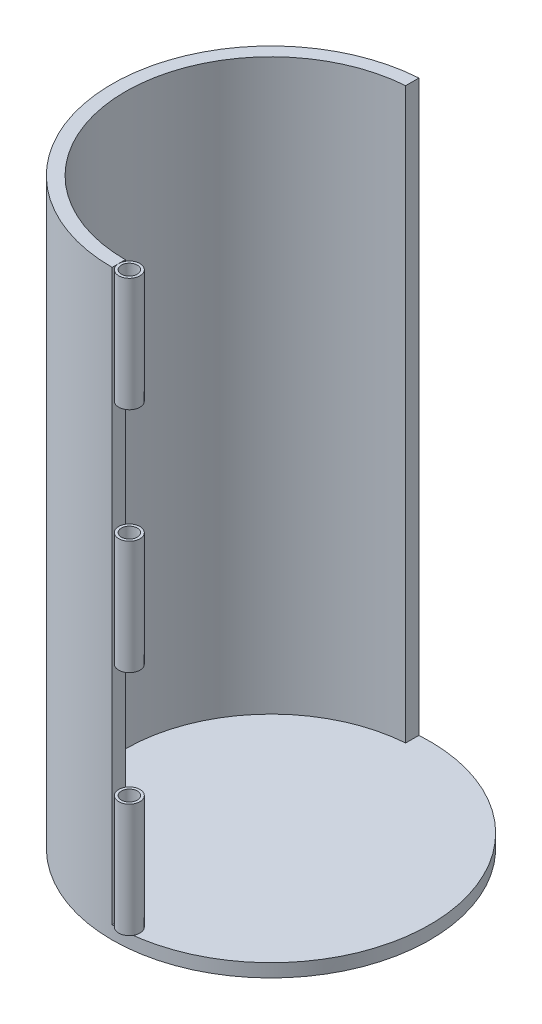
ISO-10303-21;
HEADER;
FILE_DESCRIPTION(('STEP AP214'),'2;1');
FILE_NAME('part.step','',(''),(''),'','','');
FILE_SCHEMA(('AUTOMOTIVE_DESIGN { 1 0 10303 214 1 1 1 1 }'));
ENDSEC;
DATA;
#1=APPLICATION_CONTEXT('core data for automotive mechanical design processes');
#2=APPLICATION_PROTOCOL_DEFINITION('international standard','automotive_design',2000,#1);
#3=PRODUCT_CONTEXT('',#1,'mechanical');
#4=PRODUCT('Part','Part','',(#3));
#5=PRODUCT_RELATED_PRODUCT_CATEGORY('part','',(#4));
#6=PRODUCT_DEFINITION_FORMATION('','',#4);
#7=PRODUCT_DEFINITION_CONTEXT('part definition',#1,'design');
#8=PRODUCT_DEFINITION('design','',#6,#7);
#9=PRODUCT_DEFINITION_SHAPE('','',#8);
#10=(LENGTH_UNIT() NAMED_UNIT(*) SI_UNIT(.MILLI.,.METRE.));
#11=(NAMED_UNIT(*) PLANE_ANGLE_UNIT() SI_UNIT($,.RADIAN.));
#12=(NAMED_UNIT(*) SI_UNIT($,.STERADIAN.) SOLID_ANGLE_UNIT());
#13=UNCERTAINTY_MEASURE_WITH_UNIT(LENGTH_MEASURE(1.E-05),#10,'distance_accuracy_value','');
#14=(GEOMETRIC_REPRESENTATION_CONTEXT(3) GLOBAL_UNCERTAINTY_ASSIGNED_CONTEXT((#13)) GLOBAL_UNIT_ASSIGNED_CONTEXT((#10,
#11,#12)) REPRESENTATION_CONTEXT('',''));
#15=CARTESIAN_POINT('',(0.,0.,0.));
#16=DIRECTION('',(0.,0.,1.));
#17=DIRECTION('',(1.,0.,0.));
#18=AXIS2_PLACEMENT_3D('',#15,#16,#17);
#19=CARTESIAN_POINT('',(2.,110.,28.75));
#20=DIRECTION('',(0.,1.,0.));
#21=DIRECTION('',(0.,0.,1.));
#22=AXIS2_PLACEMENT_3D('',#19,#20,#21);
#23=PLANE('',#22);
#24=CARTESIAN_POINT('',(2.,110.,28.75));
#25=DIRECTION('',(0.,1.,0.));
#26=DIRECTION('',(0.,0.,1.));
#27=AXIS2_PLACEMENT_3D('',#24,#25,#26);
#28=CIRCLE('',#27,2.);
#29=CARTESIAN_POINT('',(2.,110.,30.75));
#30=VERTEX_POINT('',#29);
#31=EDGE_CURVE('E11',#30,#30,#28,.T.);
#32=ORIENTED_EDGE('',*,*,#31,.T.);
#33=EDGE_LOOP('',(#32));
#34=FACE_BOUND('',#33,.T.);
#35=CARTESIAN_POINT('',(2.,110.,28.75));
#36=DIRECTION('',(0.,1.,0.));
#37=DIRECTION('',(0.,0.,1.));
#38=AXIS2_PLACEMENT_3D('',#35,#36,#37);
#39=CIRCLE('',#38,1.5);
#40=CARTESIAN_POINT('',(2.,110.,30.25));
#41=VERTEX_POINT('',#40);
#42=EDGE_CURVE('E57',#41,#41,#39,.T.);
#43=ORIENTED_EDGE('',*,*,#42,.F.);
#44=EDGE_LOOP('',(#43));
#45=FACE_BOUND('',#44,.T.);
#46=ADVANCED_FACE('F46',(#34,#45),#23,.T.);
#47=CARTESIAN_POINT('',(2.,88.5,28.75));
#48=DIRECTION('',(0.,1.,0.));
#49=DIRECTION('',(0.,0.,1.));
#50=AXIS2_PLACEMENT_3D('',#47,#48,#49);
#51=PLANE('',#50);
#52=CARTESIAN_POINT('',(2.,88.5,28.75));
#53=DIRECTION('',(0.,1.,0.));
#54=DIRECTION('',(0.,0.,1.));
#55=AXIS2_PLACEMENT_3D('',#52,#53,#54);
#56=CIRCLE('',#55,2.);
#57=CARTESIAN_POINT('',(2.,88.5,30.75));
#58=VERTEX_POINT('',#57);
#59=EDGE_CURVE('E50',#58,#58,#56,.T.);
#60=ORIENTED_EDGE('',*,*,#59,.F.);
#61=EDGE_LOOP('',(#60));
#62=FACE_BOUND('',#61,.T.);
#63=CARTESIAN_POINT('',(2.,88.5,28.75));
#64=DIRECTION('',(0.,1.,0.));
#65=DIRECTION('',(0.,0.,1.));
#66=AXIS2_PLACEMENT_3D('',#63,#64,#65);
#67=CIRCLE('',#66,1.5);
#68=CARTESIAN_POINT('',(2.,88.5,30.25));
#69=VERTEX_POINT('',#68);
#70=EDGE_CURVE('E59',#69,#69,#67,.T.);
#71=ORIENTED_EDGE('',*,*,#70,.T.);
#72=EDGE_LOOP('',(#71));
#73=FACE_BOUND('',#72,.T.);
#74=ADVANCED_FACE('F69',(#62,#73),#51,.F.);
#75=CARTESIAN_POINT('',(2.,110.,28.75));
#76=DIRECTION('',(0.,-1.,0.));
#77=DIRECTION('',(0.,0.,-1.));
#78=AXIS2_PLACEMENT_3D('',#75,#76,#77);
#79=CYLINDRICAL_SURFACE('',#78,2.);
#80=ORIENTED_EDGE('',*,*,#31,.F.);
#81=EDGE_LOOP('',(#80));
#82=FACE_BOUND('',#81,.T.);
#83=ORIENTED_EDGE('',*,*,#59,.T.);
#84=EDGE_LOOP('',(#83));
#85=FACE_BOUND('',#84,.T.);
#86=ADVANCED_FACE('F48',(#82,#85),#79,.T.);
#87=CARTESIAN_POINT('',(2.,110.,28.75));
#88=DIRECTION('',(0.,-1.,0.));
#89=DIRECTION('',(0.,0.,-1.));
#90=AXIS2_PLACEMENT_3D('',#87,#88,#89);
#91=CYLINDRICAL_SURFACE('',#90,1.5);
#92=ORIENTED_EDGE('',*,*,#42,.T.);
#93=EDGE_LOOP('',(#92));
#94=FACE_BOUND('',#93,.T.);
#95=ORIENTED_EDGE('',*,*,#70,.F.);
#96=EDGE_LOOP('',(#95));
#97=FACE_BOUND('',#96,.T.);
#98=ADVANCED_FACE('F65',(#94,#97),#91,.F.);
#99=CLOSED_SHELL('',(#46,#74,#86,#98));
#100=MANIFOLD_SOLID_BREP('B2',#99);
#101=CARTESIAN_POINT('',(2.,67.,28.75));
#102=DIRECTION('',(0.,1.,0.));
#103=DIRECTION('',(0.,0.,1.));
#104=AXIS2_PLACEMENT_3D('',#101,#102,#103);
#105=PLANE('',#104);
#106=CARTESIAN_POINT('',(2.,67.,28.75));
#107=DIRECTION('',(0.,1.,0.));
#108=DIRECTION('',(0.,0.,1.));
#109=AXIS2_PLACEMENT_3D('',#106,#107,#108);
#110=CIRCLE('',#109,2.);
#111=CARTESIAN_POINT('',(2.,67.,30.75));
#112=VERTEX_POINT('',#111);
#113=EDGE_CURVE('E45',#112,#112,#110,.T.);
#114=ORIENTED_EDGE('',*,*,#113,.T.);
#115=EDGE_LOOP('',(#114));
#116=FACE_BOUND('',#115,.T.);
#117=CARTESIAN_POINT('',(2.,67.,28.75));
#118=DIRECTION('',(0.,1.,0.));
#119=DIRECTION('',(0.,0.,1.));
#120=AXIS2_PLACEMENT_3D('',#117,#118,#119);
#121=CIRCLE('',#120,1.5);
#122=CARTESIAN_POINT('',(2.,67.,30.25));
#123=VERTEX_POINT('',#122);
#124=EDGE_CURVE('E135',#123,#123,#121,.T.);
#125=ORIENTED_EDGE('',*,*,#124,.F.);
#126=EDGE_LOOP('',(#125));
#127=FACE_BOUND('',#126,.T.);
#128=ADVANCED_FACE('F124',(#116,#127),#105,.T.);
#129=CARTESIAN_POINT('',(2.,45.5,28.75));
#130=DIRECTION('',(0.,1.,0.));
#131=DIRECTION('',(0.,0.,1.));
#132=AXIS2_PLACEMENT_3D('',#129,#130,#131);
#133=PLANE('',#132);
#134=CARTESIAN_POINT('',(2.,45.5,28.75));
#135=DIRECTION('',(0.,1.,0.));
#136=DIRECTION('',(0.,0.,1.));
#137=AXIS2_PLACEMENT_3D('',#134,#135,#136);
#138=CIRCLE('',#137,2.);
#139=CARTESIAN_POINT('',(2.,45.5,30.75));
#140=VERTEX_POINT('',#139);
#141=EDGE_CURVE('E128',#140,#140,#138,.T.);
#142=ORIENTED_EDGE('',*,*,#141,.F.);
#143=EDGE_LOOP('',(#142));
#144=FACE_BOUND('',#143,.T.);
#145=CARTESIAN_POINT('',(2.,45.5,28.75));
#146=DIRECTION('',(0.,1.,0.));
#147=DIRECTION('',(0.,0.,1.));
#148=AXIS2_PLACEMENT_3D('',#145,#146,#147);
#149=CIRCLE('',#148,1.5);
#150=CARTESIAN_POINT('',(2.,45.5,30.25));
#151=VERTEX_POINT('',#150);
#152=EDGE_CURVE('E137',#151,#151,#149,.T.);
#153=ORIENTED_EDGE('',*,*,#152,.T.);
#154=EDGE_LOOP('',(#153));
#155=FACE_BOUND('',#154,.T.);
#156=ADVANCED_FACE('F147',(#144,#155),#133,.F.);
#157=CARTESIAN_POINT('',(2.,67.,28.75));
#158=DIRECTION('',(0.,-1.,0.));
#159=DIRECTION('',(0.,0.,-1.));
#160=AXIS2_PLACEMENT_3D('',#157,#158,#159);
#161=CYLINDRICAL_SURFACE('',#160,2.);
#162=ORIENTED_EDGE('',*,*,#113,.F.);
#163=EDGE_LOOP('',(#162));
#164=FACE_BOUND('',#163,.T.);
#165=ORIENTED_EDGE('',*,*,#141,.T.);
#166=EDGE_LOOP('',(#165));
#167=FACE_BOUND('',#166,.T.);
#168=ADVANCED_FACE('F126',(#164,#167),#161,.T.);
#169=CARTESIAN_POINT('',(2.,67.,28.75));
#170=DIRECTION('',(0.,-1.,0.));
#171=DIRECTION('',(0.,0.,-1.));
#172=AXIS2_PLACEMENT_3D('',#169,#170,#171);
#173=CYLINDRICAL_SURFACE('',#172,1.5);
#174=ORIENTED_EDGE('',*,*,#124,.T.);
#175=EDGE_LOOP('',(#174));
#176=FACE_BOUND('',#175,.T.);
#177=ORIENTED_EDGE('',*,*,#152,.F.);
#178=EDGE_LOOP('',(#177));
#179=FACE_BOUND('',#178,.T.);
#180=ADVANCED_FACE('F143',(#176,#179),#173,.F.);
#181=CLOSED_SHELL('',(#128,#156,#168,#180));
#182=MANIFOLD_SOLID_BREP('B6',#181);
#183=CARTESIAN_POINT('',(2.,24.,28.75));
#184=DIRECTION('',(0.,1.,0.));
#185=DIRECTION('',(0.,0.,1.));
#186=AXIS2_PLACEMENT_3D('',#183,#184,#185);
#187=PLANE('',#186);
#188=CARTESIAN_POINT('',(2.,24.,28.75));
#189=DIRECTION('',(0.,1.,0.));
#190=DIRECTION('',(0.,0.,1.));
#191=AXIS2_PLACEMENT_3D('',#188,#189,#190);
#192=CIRCLE('',#191,2.);
#193=CARTESIAN_POINT('',(2.,24.,30.75));
#194=VERTEX_POINT('',#193);
#195=EDGE_CURVE('E123',#194,#194,#192,.T.);
#196=ORIENTED_EDGE('',*,*,#195,.T.);
#197=EDGE_LOOP('',(#196));
#198=FACE_BOUND('',#197,.T.);
#199=CARTESIAN_POINT('',(2.,24.,28.75));
#200=DIRECTION('',(0.,1.,0.));
#201=DIRECTION('',(0.,0.,1.));
#202=AXIS2_PLACEMENT_3D('',#199,#200,#201);
#203=CIRCLE('',#202,1.5);
#204=CARTESIAN_POINT('',(2.,24.,30.25));
#205=VERTEX_POINT('',#204);
#206=EDGE_CURVE('E214',#205,#205,#203,.T.);
#207=ORIENTED_EDGE('',*,*,#206,.F.);
#208=EDGE_LOOP('',(#207));
#209=FACE_BOUND('',#208,.T.);
#210=ADVANCED_FACE('F203',(#198,#209),#187,.T.);
#211=CARTESIAN_POINT('',(2.,2.5,28.75));
#212=DIRECTION('',(0.,1.,0.));
#213=DIRECTION('',(0.,0.,1.));
#214=AXIS2_PLACEMENT_3D('',#211,#212,#213);
#215=PLANE('',#214);
#216=CARTESIAN_POINT('',(2.,2.5,28.75));
#217=DIRECTION('',(0.,1.,0.));
#218=DIRECTION('',(0.,0.,1.));
#219=AXIS2_PLACEMENT_3D('',#216,#217,#218);
#220=CIRCLE('',#219,2.);
#221=CARTESIAN_POINT('',(2.,2.5,30.75));
#222=VERTEX_POINT('',#221);
#223=EDGE_CURVE('E207',#222,#222,#220,.T.);
#224=ORIENTED_EDGE('',*,*,#223,.F.);
#225=EDGE_LOOP('',(#224));
#226=FACE_BOUND('',#225,.T.);
#227=CARTESIAN_POINT('',(2.,2.5,28.75));
#228=DIRECTION('',(0.,1.,0.));
#229=DIRECTION('',(0.,0.,1.));
#230=AXIS2_PLACEMENT_3D('',#227,#228,#229);
#231=CIRCLE('',#230,1.5);
#232=CARTESIAN_POINT('',(2.,2.5,30.25));
#233=VERTEX_POINT('',#232);
#234=EDGE_CURVE('E216',#233,#233,#231,.T.);
#235=ORIENTED_EDGE('',*,*,#234,.T.);
#236=EDGE_LOOP('',(#235));
#237=FACE_BOUND('',#236,.T.);
#238=ADVANCED_FACE('F226',(#226,#237),#215,.F.);
#239=CARTESIAN_POINT('',(2.,24.,28.75));
#240=DIRECTION('',(0.,-1.,0.));
#241=DIRECTION('',(0.,0.,-1.));
#242=AXIS2_PLACEMENT_3D('',#239,#240,#241);
#243=CYLINDRICAL_SURFACE('',#242,2.);
#244=ORIENTED_EDGE('',*,*,#195,.F.);
#245=EDGE_LOOP('',(#244));
#246=FACE_BOUND('',#245,.T.);
#247=ORIENTED_EDGE('',*,*,#223,.T.);
#248=EDGE_LOOP('',(#247));
#249=FACE_BOUND('',#248,.T.);
#250=ADVANCED_FACE('F205',(#246,#249),#243,.T.);
#251=CARTESIAN_POINT('',(2.,24.,28.75));
#252=DIRECTION('',(0.,-1.,0.));
#253=DIRECTION('',(0.,0.,-1.));
#254=AXIS2_PLACEMENT_3D('',#251,#252,#253);
#255=CYLINDRICAL_SURFACE('',#254,1.5);
#256=ORIENTED_EDGE('',*,*,#206,.T.);
#257=EDGE_LOOP('',(#256));
#258=FACE_BOUND('',#257,.T.);
#259=ORIENTED_EDGE('',*,*,#234,.F.);
#260=EDGE_LOOP('',(#259));
#261=FACE_BOUND('',#260,.T.);
#262=ADVANCED_FACE('F222',(#258,#261),#255,.F.);
#263=CLOSED_SHELL('',(#210,#238,#250,#262));
#264=MANIFOLD_SOLID_BREP('B40',#263);
#265=CARTESIAN_POINT('',(0.,110.,0.));
#266=DIRECTION('',(0.,1.,0.));
#267=DIRECTION('',(0.,0.,1.));
#268=AXIS2_PLACEMENT_3D('',#265,#266,#267);
#269=PLANE('',#268);
#270=CARTESIAN_POINT('',(0.,110.,0.));
#271=DIRECTION('',(0.,1.,0.));
#272=DIRECTION('',(0.,0.,1.));
#273=AXIS2_PLACEMENT_3D('',#270,#271,#272);
#274=CIRCLE('',#273,27.5);
#275=CARTESIAN_POINT('',(-2.,110.,-27.427176303805));
#276=VERTEX_POINT('',#275);
#277=CARTESIAN_POINT('',(0.,110.,27.5));
#278=VERTEX_POINT('',#277);
#279=EDGE_CURVE('E342',#276,#278,#274,.T.);
#280=ORIENTED_EDGE('',*,*,#279,.F.);
#281=DIRECTION('',(0.,0.,-1.));
#282=VECTOR('',#281,1.);
#283=CARTESIAN_POINT('',(-2.,110.,-27.427176303805));
#284=LINE('',#283,#282);
#285=CARTESIAN_POINT('',(-2.,110.,-29.9332590941915));
#286=VERTEX_POINT('',#285);
#287=EDGE_CURVE('E296',#276,#286,#284,.T.);
#288=ORIENTED_EDGE('',*,*,#287,.T.);
#289=CARTESIAN_POINT('',(0.,110.,0.));
#290=DIRECTION('',(0.,1.,0.));
#291=DIRECTION('',(0.,0.,1.));
#292=AXIS2_PLACEMENT_3D('',#289,#290,#291);
#293=CIRCLE('',#292,30.);
#294=CARTESIAN_POINT('',(0.,110.,30.));
#295=VERTEX_POINT('',#294);
#296=EDGE_CURVE('E344',#286,#295,#293,.T.);
#297=ORIENTED_EDGE('',*,*,#296,.T.);
#298=DIRECTION('',(0.,0.,1.));
#299=VECTOR('',#298,1.);
#300=CARTESIAN_POINT('',(0.,110.,30.));
#301=LINE('',#300,#299);
#302=EDGE_CURVE('E329',#278,#295,#301,.T.);
#303=ORIENTED_EDGE('',*,*,#302,.F.);
#304=EDGE_LOOP('',(#280,#288,#297,#303));
#305=FACE_BOUND('',#304,.T.);
#306=ADVANCED_FACE('F273',(#305),#269,.T.);
#307=CARTESIAN_POINT('',(0.,2.5,0.));
#308=DIRECTION('',(0.,-1.,0.));
#309=DIRECTION('',(0.,0.,-1.));
#310=AXIS2_PLACEMENT_3D('',#307,#308,#309);
#311=CYLINDRICAL_SURFACE('',#310,30.);
#312=ORIENTED_EDGE('',*,*,#296,.F.);
#313=DIRECTION('',(0.,-1.,0.));
#314=VECTOR('',#313,1.);
#315=CARTESIAN_POINT('',(-2.,391.5625,-29.9332590941915));
#316=LINE('',#315,#314);
#317=CARTESIAN_POINT('',(-2.,2.5,-29.9332590941915));
#318=VERTEX_POINT('',#317);
#319=EDGE_CURVE('E325',#286,#318,#316,.T.);
#320=ORIENTED_EDGE('',*,*,#319,.T.);
#321=CARTESIAN_POINT('',(0.,2.5,0.));
#322=DIRECTION('',(0.,1.,0.));
#323=DIRECTION('',(0.,0.,-1.));
#324=AXIS2_PLACEMENT_3D('',#321,#322,#323);
#325=CIRCLE('',#324,30.);
#326=CARTESIAN_POINT('',(0.,2.5,30.));
#327=VERTEX_POINT('',#326);
#328=EDGE_CURVE('E288',#327,#318,#325,.T.);
#329=ORIENTED_EDGE('',*,*,#328,.F.);
#330=DIRECTION('',(0.,1.,0.));
#331=VECTOR('',#330,1.);
#332=CARTESIAN_POINT('',(0.,2.5,30.));
#333=LINE('',#332,#331);
#334=EDGE_CURVE('E336',#327,#295,#333,.T.);
#335=ORIENTED_EDGE('',*,*,#334,.T.);
#336=EDGE_LOOP('',(#312,#320,#329,#335));
#337=FACE_BOUND('',#336,.T.);
#338=CARTESIAN_POINT('',(0.,0.,0.));
#339=DIRECTION('',(0.,1.,0.));
#340=DIRECTION('',(0.,0.,1.));
#341=AXIS2_PLACEMENT_3D('',#338,#339,#340);
#342=CIRCLE('',#341,30.);
#343=CARTESIAN_POINT('',(0.,0.,30.));
#344=VERTEX_POINT('',#343);
#345=EDGE_CURVE('E281',#344,#344,#342,.T.);
#346=ORIENTED_EDGE('',*,*,#345,.T.);
#347=EDGE_LOOP('',(#346));
#348=FACE_BOUND('',#347,.T.);
#349=ADVANCED_FACE('F275',(#337,#348),#311,.T.);
#350=CARTESIAN_POINT('',(0.,0.,0.));
#351=DIRECTION('',(0.,1.,0.));
#352=DIRECTION('',(0.,0.,1.));
#353=AXIS2_PLACEMENT_3D('',#350,#351,#352);
#354=PLANE('',#353);
#355=ORIENTED_EDGE('',*,*,#345,.F.);
#356=EDGE_LOOP('',(#355));
#357=FACE_BOUND('',#356,.T.);
#358=ADVANCED_FACE('F349',(#357),#354,.F.);
#359=CARTESIAN_POINT('',(0.,110.,0.));
#360=DIRECTION('',(0.,-1.,0.));
#361=DIRECTION('',(0.,0.,-1.));
#362=AXIS2_PLACEMENT_3D('',#359,#360,#361);
#363=CYLINDRICAL_SURFACE('',#362,27.5);
#364=DIRECTION('',(0.,-1.,0.));
#365=VECTOR('',#364,1.);
#366=CARTESIAN_POINT('',(-2.,391.5625,-27.427176303805));
#367=LINE('',#366,#365);
#368=CARTESIAN_POINT('',(-2.,2.5,-27.427176303805));
#369=VERTEX_POINT('',#368);
#370=EDGE_CURVE('E317',#276,#369,#367,.T.);
#371=ORIENTED_EDGE('',*,*,#370,.F.);
#372=ORIENTED_EDGE('',*,*,#279,.T.);
#373=DIRECTION('',(0.,-1.,0.));
#374=VECTOR('',#373,1.);
#375=CARTESIAN_POINT('',(0.,110.,27.5));
#376=LINE('',#375,#374);
#377=CARTESIAN_POINT('',(0.,2.5,27.5));
#378=VERTEX_POINT('',#377);
#379=EDGE_CURVE('E319',#378,#278,#376,.F.);
#380=ORIENTED_EDGE('',*,*,#379,.F.);
#381=CARTESIAN_POINT('',(0.,2.5,0.));
#382=DIRECTION('',(0.,1.,0.));
#383=DIRECTION('',(0.,0.,1.));
#384=AXIS2_PLACEMENT_3D('',#381,#382,#383);
#385=CIRCLE('',#384,27.5);
#386=EDGE_CURVE('E201',#378,#369,#385,.F.);
#387=ORIENTED_EDGE('',*,*,#386,.T.);
#388=EDGE_LOOP('',(#371,#372,#380,#387));
#389=FACE_BOUND('',#388,.T.);
#390=ADVANCED_FACE('F315',(#389),#363,.F.);
#391=CARTESIAN_POINT('',(0.,2.5,0.));
#392=DIRECTION('',(0.,1.,0.));
#393=DIRECTION('',(0.,0.,1.));
#394=AXIS2_PLACEMENT_3D('',#391,#392,#393);
#395=PLANE('',#394);
#396=DIRECTION('',(0.,0.,-1.));
#397=VECTOR('',#396,1.);
#398=CARTESIAN_POINT('',(-2.,2.5,-27.427176303805));
#399=LINE('',#398,#397);
#400=EDGE_CURVE('E321',#369,#318,#399,.T.);
#401=ORIENTED_EDGE('',*,*,#400,.F.);
#402=ORIENTED_EDGE('',*,*,#386,.F.);
#403=DIRECTION('',(0.,0.,1.));
#404=VECTOR('',#403,1.);
#405=CARTESIAN_POINT('',(0.,2.5,30.));
#406=LINE('',#405,#404);
#407=EDGE_CURVE('E334',#378,#327,#406,.T.);
#408=ORIENTED_EDGE('',*,*,#407,.T.);
#409=ORIENTED_EDGE('',*,*,#328,.T.);
#410=EDGE_LOOP('',(#401,#402,#408,#409));
#411=FACE_BOUND('',#410,.T.);
#412=ADVANCED_FACE('F322',(#411),#395,.T.);
#413=CARTESIAN_POINT('',(0.,2.5,30.));
#414=DIRECTION('',(-1.,0.,0.));
#415=DIRECTION('',(0.,0.,1.));
#416=AXIS2_PLACEMENT_3D('',#413,#414,#415);
#417=PLANE('',#416);
#418=ORIENTED_EDGE('',*,*,#379,.T.);
#419=ORIENTED_EDGE('',*,*,#302,.T.);
#420=ORIENTED_EDGE('',*,*,#334,.F.);
#421=ORIENTED_EDGE('',*,*,#407,.F.);
#422=EDGE_LOOP('',(#418,#419,#420,#421));
#423=FACE_BOUND('',#422,.T.);
#424=ADVANCED_FACE('F367',(#423),#417,.F.);
#425=CARTESIAN_POINT('',(-2.,391.5625,-27.427176303805));
#426=DIRECTION('',(-1.,0.,0.));
#427=DIRECTION('',(0.,0.,1.));
#428=AXIS2_PLACEMENT_3D('',#425,#426,#427);
#429=PLANE('',#428);
#430=ORIENTED_EDGE('',*,*,#370,.T.);
#431=ORIENTED_EDGE('',*,*,#400,.T.);
#432=ORIENTED_EDGE('',*,*,#319,.F.);
#433=ORIENTED_EDGE('',*,*,#287,.F.);
#434=EDGE_LOOP('',(#430,#431,#432,#433));
#435=FACE_BOUND('',#434,.T.);
#436=ADVANCED_FACE('F327',(#435),#429,.F.);
#437=CLOSED_SHELL('',(#306,#349,#358,#390,#412,#424,#436));
#438=MANIFOLD_SOLID_BREP('B118',#437);
#439=ADVANCED_BREP_SHAPE_REPRESENTATION('',(#18,#100,#182,#264,#438),#14);
#440=SHAPE_DEFINITION_REPRESENTATION(#9,#439);
ENDSEC;
END-ISO-10303-21;
